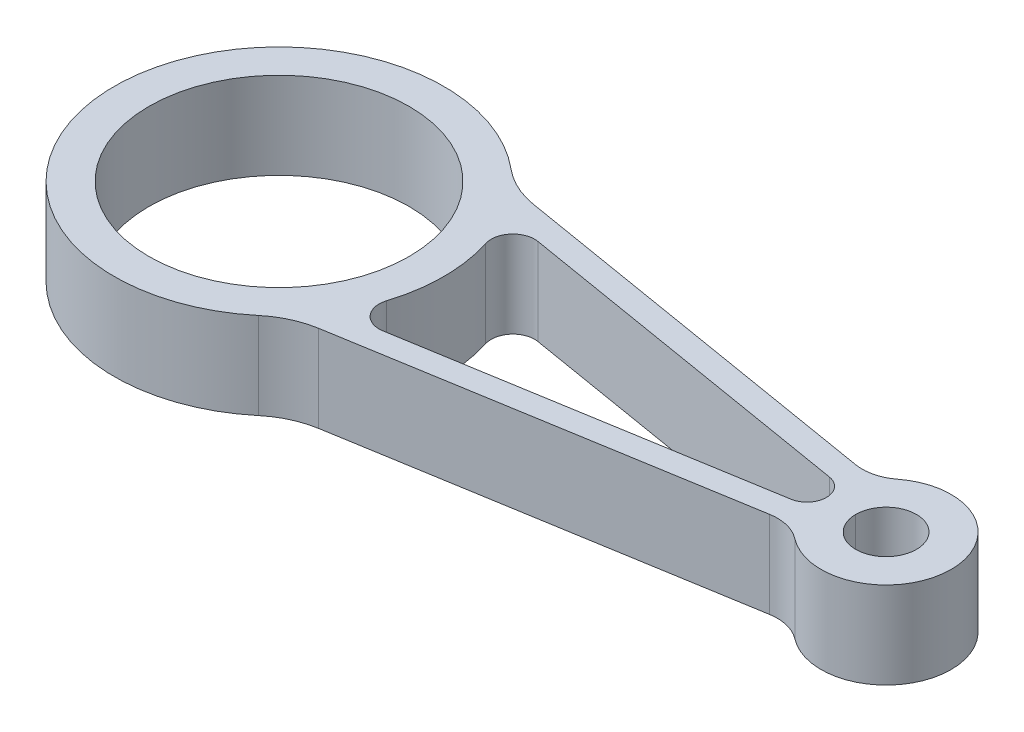
ISO-10303-21;
HEADER;
FILE_DESCRIPTION(('STEP AP214'),'2;1');
FILE_NAME('part.step','',(''),(''),'','','');
FILE_SCHEMA(('AUTOMOTIVE_DESIGN { 1 0 10303 214 1 1 1 1 }'));
ENDSEC;
DATA;
#1=APPLICATION_CONTEXT('core data for automotive mechanical design processes');
#2=APPLICATION_PROTOCOL_DEFINITION('international standard','automotive_design',2000,#1);
#3=PRODUCT_CONTEXT('',#1,'mechanical');
#4=PRODUCT('Part','Part','',(#3));
#5=PRODUCT_RELATED_PRODUCT_CATEGORY('part','',(#4));
#6=PRODUCT_DEFINITION_FORMATION('','',#4);
#7=PRODUCT_DEFINITION_CONTEXT('part definition',#1,'design');
#8=PRODUCT_DEFINITION('design','',#6,#7);
#9=PRODUCT_DEFINITION_SHAPE('','',#8);
#10=(LENGTH_UNIT() NAMED_UNIT(*) SI_UNIT(.MILLI.,.METRE.));
#11=(NAMED_UNIT(*) PLANE_ANGLE_UNIT() SI_UNIT($,.RADIAN.));
#12=(NAMED_UNIT(*) SI_UNIT($,.STERADIAN.) SOLID_ANGLE_UNIT());
#13=UNCERTAINTY_MEASURE_WITH_UNIT(LENGTH_MEASURE(1.E-05),#10,'distance_accuracy_value','');
#14=(GEOMETRIC_REPRESENTATION_CONTEXT(3) GLOBAL_UNCERTAINTY_ASSIGNED_CONTEXT((#13)) GLOBAL_UNIT_ASSIGNED_CONTEXT((#10,
#11,#12)) REPRESENTATION_CONTEXT('',''));
#15=CARTESIAN_POINT('',(0.,0.,0.));
#16=DIRECTION('',(0.,0.,1.));
#17=DIRECTION('',(1.,0.,0.));
#18=AXIS2_PLACEMENT_3D('',#15,#16,#17);
#19=CARTESIAN_POINT('',(140.,10.,0.));
#20=DIRECTION('',(0.,-1.,0.));
#21=DIRECTION('',(0.,0.,-1.));
#22=AXIS2_PLACEMENT_3D('',#19,#20,#21);
#23=CYLINDRICAL_SURFACE('',#22,7.00000000000001);
#24=CARTESIAN_POINT('',(140.,10.,0.));
#25=DIRECTION('',(0.,1.,0.));
#26=DIRECTION('',(0.,0.,1.));
#27=AXIS2_PLACEMENT_3D('',#24,#25,#26);
#28=CIRCLE('',#27,7.00000000000001);
#29=CARTESIAN_POINT('',(147.,10.,0.));
#30=VERTEX_POINT('',#29);
#31=CARTESIAN_POINT('',(133.,10.,0.));
#32=VERTEX_POINT('',#31);
#33=EDGE_CURVE('E215',#30,#32,#28,.T.);
#34=ORIENTED_EDGE('',*,*,#33,.T.);
#35=DIRECTION('',(0.,-1.,0.));
#36=VECTOR('',#35,1.);
#37=CARTESIAN_POINT('',(133.,10.,0.));
#38=LINE('',#37,#36);
#39=CARTESIAN_POINT('',(133.,-10.,0.));
#40=VERTEX_POINT('',#39);
#41=EDGE_CURVE('E11',#32,#40,#38,.T.);
#42=ORIENTED_EDGE('',*,*,#41,.T.);
#43=CARTESIAN_POINT('',(140.,-10.,0.));
#44=DIRECTION('',(0.,1.,0.));
#45=DIRECTION('',(0.,0.,1.));
#46=AXIS2_PLACEMENT_3D('',#43,#44,#45);
#47=CIRCLE('',#46,7.00000000000001);
#48=CARTESIAN_POINT('',(147.,-10.,0.));
#49=VERTEX_POINT('',#48);
#50=EDGE_CURVE('E219',#49,#40,#47,.T.);
#51=ORIENTED_EDGE('',*,*,#50,.F.);
#52=DIRECTION('',(0.,1.,0.));
#53=VECTOR('',#52,1.);
#54=CARTESIAN_POINT('',(147.,10.,0.));
#55=LINE('',#54,#53);
#56=EDGE_CURVE('E53',#49,#30,#55,.T.);
#57=ORIENTED_EDGE('',*,*,#56,.T.);
#58=EDGE_LOOP('',(#34,#42,#51,#57));
#59=FACE_BOUND('',#58,.T.);
#60=ADVANCED_FACE('F44',(#59),#23,.F.);
#61=CARTESIAN_POINT('',(0.,10.,0.));
#62=DIRECTION('',(0.,1.,0.));
#63=DIRECTION('',(0.,0.,1.));
#64=AXIS2_PLACEMENT_3D('',#61,#62,#63);
#65=PLANE('',#64);
#66=CARTESIAN_POINT('',(121.739130434783,10.,0.));
#67=DIRECTION('',(0.,1.,0.));
#68=DIRECTION('',(0.,0.,-1.));
#69=AXIS2_PLACEMENT_3D('',#66,#67,#68);
#70=CIRCLE('',#69,4.5);
#71=CARTESIAN_POINT('',(122.310930345192,10.,4.4635238167233));
#72=VERTEX_POINT('',#71);
#73=CARTESIAN_POINT('',(122.478416149068,10.,-4.43885758192951));
#74=VERTEX_POINT('',#73);
#75=EDGE_CURVE('E162',#72,#74,#70,.T.);
#76=ORIENTED_EDGE('',*,*,#75,.F.);
#77=DIRECTION('',(0.986412795984335,0.,-0.164285714285714));
#78=VECTOR('',#77,1.);
#79=CARTESIAN_POINT('',(122.310930345192,10.,4.4635238167233));
#80=LINE('',#79,#78);
#81=CARTESIAN_POINT('',(41.6520342039407,10.,17.8971536520292));
#82=VERTEX_POINT('',#81);
#83=EDGE_CURVE('E181',#82,#72,#80,.T.);
#84=ORIENTED_EDGE('',*,*,#83,.F.);
#85=CARTESIAN_POINT('',(41.0071259869049,10.,12.9389187451697));
#86=DIRECTION('',(0.,1.,0.));
#87=DIRECTION('',(0.,0.,1.));
#88=AXIS2_PLACEMENT_3D('',#85,#86,#87);
#89=CIRCLE('',#88,5.);
#90=CARTESIAN_POINT('',(36.2388555233113,10.,11.4343933096849));
#91=VERTEX_POINT('',#90);
#92=EDGE_CURVE('E184',#91,#82,#89,.T.);
#93=ORIENTED_EDGE('',*,*,#92,.F.);
#94=CARTESIAN_POINT('',(0.,10.,0.));
#95=DIRECTION('',(0.,-1.,0.));
#96=DIRECTION('',(0.,0.,-1.));
#97=AXIS2_PLACEMENT_3D('',#94,#95,#96);
#98=CIRCLE('',#97,38.);
#99=CARTESIAN_POINT('',(36.2388555233113,10.,-11.4343933096849));
#100=VERTEX_POINT('',#99);
#101=EDGE_CURVE('E200',#100,#91,#98,.T.);
#102=ORIENTED_EDGE('',*,*,#101,.F.);
#103=CARTESIAN_POINT('',(41.0071259869049,10.,-12.9389187451698));
#104=DIRECTION('',(0.,1.,0.));
#105=DIRECTION('',(0.,0.,1.));
#106=AXIS2_PLACEMENT_3D('',#103,#104,#105);
#107=CIRCLE('',#106,5.00000000000001);
#108=CARTESIAN_POINT('',(41.8285545583335,10.,-17.8709827250915));
#109=VERTEX_POINT('',#108);
#110=EDGE_CURVE('E197',#109,#100,#107,.T.);
#111=ORIENTED_EDGE('',*,*,#110,.F.);
#112=DIRECTION('',(-0.986412795984335,0.,-0.164285714285714));
#113=VECTOR('',#112,1.);
#114=CARTESIAN_POINT('',(41.8285545583335,10.,-17.8709827250915));
#115=LINE('',#114,#113);
#116=EDGE_CURVE('E195',#74,#109,#115,.T.);
#117=ORIENTED_EDGE('',*,*,#116,.F.);
#118=EDGE_LOOP('',(#76,#84,#93,#102,#111,#117));
#119=FACE_BOUND('',#118,.T.);
#120=CARTESIAN_POINT('',(0.,10.,0.));
#121=DIRECTION('',(0.,1.,0.));
#122=DIRECTION('',(0.,0.,1.));
#123=AXIS2_PLACEMENT_3D('',#120,#121,#122);
#124=CIRCLE('',#123,30.);
#125=CARTESIAN_POINT('',(0.,10.,30.));
#126=VERTEX_POINT('',#125);
#127=EDGE_CURVE('E222',#126,#126,#124,.T.);
#128=ORIENTED_EDGE('',*,*,#127,.F.);
#129=EDGE_LOOP('',(#128));
#130=FACE_BOUND('',#129,.T.);
#131=DIRECTION('',(-0.986412795984335,0.,-0.164285714285714));
#132=VECTOR('',#131,1.);
#133=CARTESIAN_POINT('',(27.9354736759495,10.,-25.7606154914888));
#134=LINE('',#133,#132);
#135=CARTESIAN_POINT('',(123.068754783715,10.,-9.91629645714703));
#136=VERTEX_POINT('',#135);
#137=CARTESIAN_POINT('',(33.9230677395359,10.,-24.7633898151861));
#138=VERTEX_POINT('',#137);
#139=EDGE_CURVE('E237',#136,#138,#134,.T.);
#140=ORIENTED_EDGE('',*,*,#139,.T.);
#141=CARTESIAN_POINT('',(37.2087820252502,10.,-44.4916457348727));
#142=DIRECTION('',(0.,1.,0.));
#143=DIRECTION('',(0.,0.,1.));
#144=AXIS2_PLACEMENT_3D('',#141,#142,#143);
#145=CIRCLE('',#144,20.);
#146=CARTESIAN_POINT('',(24.3781675337846,10.,-29.1496989297442));
#147=VERTEX_POINT('',#146);
#148=EDGE_CURVE('E285',#138,#147,#145,.F.);
#149=ORIENTED_EDGE('',*,*,#148,.T.);
#150=CARTESIAN_POINT('',(0.,10.,0.));
#151=DIRECTION('',(0.,1.,0.));
#152=DIRECTION('',(0.,0.,1.));
#153=AXIS2_PLACEMENT_3D('',#150,#151,#152);
#154=CIRCLE('',#153,38.);
#155=CARTESIAN_POINT('',(24.3781675337846,10.,29.1496989297442));
#156=VERTEX_POINT('',#155);
#157=EDGE_CURVE('E228',#147,#156,#154,.T.);
#158=ORIENTED_EDGE('',*,*,#157,.T.);
#159=CARTESIAN_POINT('',(37.2087820252501,10.,44.4916457348728));
#160=DIRECTION('',(0.,1.,0.));
#161=DIRECTION('',(0.,0.,1.));
#162=AXIS2_PLACEMENT_3D('',#159,#160,#161);
#163=CIRCLE('',#162,20.);
#164=CARTESIAN_POINT('',(33.9230677395358,10.,24.7633898151861));
#165=VERTEX_POINT('',#164);
#166=EDGE_CURVE('E281',#156,#165,#163,.F.);
#167=ORIENTED_EDGE('',*,*,#166,.T.);
#168=DIRECTION('',(0.986412795984335,0.,-0.164285714285714));
#169=VECTOR('',#168,1.);
#170=CARTESIAN_POINT('',(128.063755469258,10.,9.08438586269532));
#171=LINE('',#170,#169);
#172=CARTESIAN_POINT('',(123.068754783715,10.,9.91629645714704));
#173=VERTEX_POINT('',#172);
#174=EDGE_CURVE('E231',#165,#173,#171,.T.);
#175=ORIENTED_EDGE('',*,*,#174,.T.);
#176=CARTESIAN_POINT('',(124.711611926572,10.,19.7804244169904));
#177=DIRECTION('',(0.,1.,0.));
#178=DIRECTION('',(0.,0.,1.));
#179=AXIS2_PLACEMENT_3D('',#176,#177,#178);
#180=CIRCLE('',#179,10.);
#181=CARTESIAN_POINT('',(130.826967155943,10.,11.8682546501942));
#182=VERTEX_POINT('',#181);
#183=EDGE_CURVE('E263',#173,#182,#180,.F.);
#184=ORIENTED_EDGE('',*,*,#183,.T.);
#185=CARTESIAN_POINT('',(140.,10.,0.));
#186=DIRECTION('',(0.,1.,0.));
#187=DIRECTION('',(0.,0.,1.));
#188=AXIS2_PLACEMENT_3D('',#185,#186,#187);
#189=CIRCLE('',#188,15.);
#190=CARTESIAN_POINT('',(130.826967155943,10.,-11.8682546501942));
#191=VERTEX_POINT('',#190);
#192=EDGE_CURVE('E234',#182,#191,#189,.T.);
#193=ORIENTED_EDGE('',*,*,#192,.T.);
#194=CARTESIAN_POINT('',(124.711611926572,10.,-19.7804244169904));
#195=DIRECTION('',(0.,1.,0.));
#196=DIRECTION('',(0.,0.,1.));
#197=AXIS2_PLACEMENT_3D('',#194,#195,#196);
#198=CIRCLE('',#197,10.);
#199=EDGE_CURVE('E267',#191,#136,#198,.F.);
#200=ORIENTED_EDGE('',*,*,#199,.T.);
#201=EDGE_LOOP('',(#140,#149,#158,#167,#175,#184,#193,#200));
#202=FACE_BOUND('',#201,.T.);
#203=ORIENTED_EDGE('',*,*,#33,.F.);
#204=EDGE_CURVE('E218',#32,#30,#28,.T.);
#205=ORIENTED_EDGE('',*,*,#204,.F.);
#206=EDGE_LOOP('',(#203,#205));
#207=FACE_BOUND('',#206,.T.);
#208=ADVANCED_FACE('F293',(#119,#130,#202,#207),#65,.T.);
#209=CARTESIAN_POINT('',(0.,-10.,0.));
#210=DIRECTION('',(0.,1.,0.));
#211=DIRECTION('',(0.,0.,1.));
#212=AXIS2_PLACEMENT_3D('',#209,#210,#211);
#213=PLANE('',#212);
#214=DIRECTION('',(0.986412795984335,0.,-0.164285714285714));
#215=VECTOR('',#214,1.);
#216=CARTESIAN_POINT('',(122.310930345192,-10.,4.4635238167233));
#217=LINE('',#216,#215);
#218=CARTESIAN_POINT('',(41.6520342039407,-10.,17.8971536520292));
#219=VERTEX_POINT('',#218);
#220=CARTESIAN_POINT('',(122.310930345192,-10.,4.4635238167233));
#221=VERTEX_POINT('',#220);
#222=EDGE_CURVE('E167',#219,#221,#217,.T.);
#223=ORIENTED_EDGE('',*,*,#222,.T.);
#224=CARTESIAN_POINT('',(121.739130434783,-10.,0.));
#225=DIRECTION('',(0.,1.,0.));
#226=DIRECTION('',(0.,0.,-1.));
#227=AXIS2_PLACEMENT_3D('',#224,#225,#226);
#228=CIRCLE('',#227,4.5);
#229=CARTESIAN_POINT('',(122.478416149068,-10.,-4.43885758192951));
#230=VERTEX_POINT('',#229);
#231=EDGE_CURVE('E159',#221,#230,#228,.T.);
#232=ORIENTED_EDGE('',*,*,#231,.T.);
#233=DIRECTION('',(-0.986412795984335,0.,-0.164285714285714));
#234=VECTOR('',#233,1.);
#235=CARTESIAN_POINT('',(41.8285545583335,-10.,-17.8709827250915));
#236=LINE('',#235,#234);
#237=CARTESIAN_POINT('',(41.8285545583335,-10.,-17.8709827250915));
#238=VERTEX_POINT('',#237);
#239=EDGE_CURVE('E171',#230,#238,#236,.T.);
#240=ORIENTED_EDGE('',*,*,#239,.T.);
#241=CARTESIAN_POINT('',(41.0071259869049,-10.,-12.9389187451698));
#242=DIRECTION('',(0.,1.,0.));
#243=DIRECTION('',(0.,0.,1.));
#244=AXIS2_PLACEMENT_3D('',#241,#242,#243);
#245=CIRCLE('',#244,5.00000000000001);
#246=CARTESIAN_POINT('',(36.2388555233113,-10.,-11.4343933096849));
#247=VERTEX_POINT('',#246);
#248=EDGE_CURVE('E175',#238,#247,#245,.T.);
#249=ORIENTED_EDGE('',*,*,#248,.T.);
#250=CARTESIAN_POINT('',(0.,-10.,0.));
#251=DIRECTION('',(0.,-1.,0.));
#252=DIRECTION('',(0.,0.,-1.));
#253=AXIS2_PLACEMENT_3D('',#250,#251,#252);
#254=CIRCLE('',#253,38.);
#255=CARTESIAN_POINT('',(36.2388555233113,-10.,11.4343933096849));
#256=VERTEX_POINT('',#255);
#257=EDGE_CURVE('E188',#247,#256,#254,.T.);
#258=ORIENTED_EDGE('',*,*,#257,.T.);
#259=CARTESIAN_POINT('',(41.0071259869049,-10.,12.9389187451697));
#260=DIRECTION('',(0.,1.,0.));
#261=DIRECTION('',(0.,0.,1.));
#262=AXIS2_PLACEMENT_3D('',#259,#260,#261);
#263=CIRCLE('',#262,5.);
#264=EDGE_CURVE('E191',#256,#219,#263,.T.);
#265=ORIENTED_EDGE('',*,*,#264,.T.);
#266=EDGE_LOOP('',(#223,#232,#240,#249,#258,#265));
#267=FACE_BOUND('',#266,.T.);
#268=CARTESIAN_POINT('',(0.,-10.,0.));
#269=DIRECTION('',(0.,1.,0.));
#270=DIRECTION('',(0.,0.,1.));
#271=AXIS2_PLACEMENT_3D('',#268,#269,#270);
#272=CIRCLE('',#271,38.);
#273=CARTESIAN_POINT('',(24.3781675337846,-10.,-29.1496989297442));
#274=VERTEX_POINT('',#273);
#275=CARTESIAN_POINT('',(24.3781675337846,-10.,29.1496989297442));
#276=VERTEX_POINT('',#275);
#277=EDGE_CURVE('E225',#274,#276,#272,.T.);
#278=ORIENTED_EDGE('',*,*,#277,.F.);
#279=CARTESIAN_POINT('',(37.2087820252502,-10.,-44.4916457348727));
#280=DIRECTION('',(0.,1.,0.));
#281=DIRECTION('',(0.,0.,1.));
#282=AXIS2_PLACEMENT_3D('',#279,#280,#281);
#283=CIRCLE('',#282,20.);
#284=CARTESIAN_POINT('',(33.9230677395359,-10.,-24.7633898151861));
#285=VERTEX_POINT('',#284);
#286=EDGE_CURVE('E283',#274,#285,#283,.T.);
#287=ORIENTED_EDGE('',*,*,#286,.T.);
#288=DIRECTION('',(-0.986412795984335,0.,-0.164285714285714));
#289=VECTOR('',#288,1.);
#290=CARTESIAN_POINT('',(27.9354736759495,-10.,-25.7606154914888));
#291=LINE('',#290,#289);
#292=CARTESIAN_POINT('',(123.068754783715,-10.,-9.91629645714703));
#293=VERTEX_POINT('',#292);
#294=EDGE_CURVE('E232',#293,#285,#291,.T.);
#295=ORIENTED_EDGE('',*,*,#294,.F.);
#296=CARTESIAN_POINT('',(124.711611926572,-10.,-19.7804244169904));
#297=DIRECTION('',(0.,1.,0.));
#298=DIRECTION('',(0.,0.,1.));
#299=AXIS2_PLACEMENT_3D('',#296,#297,#298);
#300=CIRCLE('',#299,10.);
#301=CARTESIAN_POINT('',(130.826967155943,-10.,-11.8682546501942));
#302=VERTEX_POINT('',#301);
#303=EDGE_CURVE('E265',#293,#302,#300,.T.);
#304=ORIENTED_EDGE('',*,*,#303,.T.);
#305=CARTESIAN_POINT('',(140.,-10.,0.));
#306=DIRECTION('',(0.,1.,0.));
#307=DIRECTION('',(0.,0.,1.));
#308=AXIS2_PLACEMENT_3D('',#305,#306,#307);
#309=CIRCLE('',#308,15.);
#310=CARTESIAN_POINT('',(130.826967155943,-10.,11.8682546501942));
#311=VERTEX_POINT('',#310);
#312=EDGE_CURVE('E245',#311,#302,#309,.T.);
#313=ORIENTED_EDGE('',*,*,#312,.F.);
#314=CARTESIAN_POINT('',(124.711611926572,-10.,19.7804244169904));
#315=DIRECTION('',(0.,1.,0.));
#316=DIRECTION('',(0.,0.,1.));
#317=AXIS2_PLACEMENT_3D('',#314,#315,#316);
#318=CIRCLE('',#317,10.);
#319=CARTESIAN_POINT('',(123.068754783715,-10.,9.91629645714704));
#320=VERTEX_POINT('',#319);
#321=EDGE_CURVE('E260',#311,#320,#318,.T.);
#322=ORIENTED_EDGE('',*,*,#321,.T.);
#323=DIRECTION('',(0.986412795984335,0.,-0.164285714285714));
#324=VECTOR('',#323,1.);
#325=CARTESIAN_POINT('',(128.063755469258,-10.,9.08438586269532));
#326=LINE('',#325,#324);
#327=CARTESIAN_POINT('',(33.9230677395358,-10.,24.7633898151861));
#328=VERTEX_POINT('',#327);
#329=EDGE_CURVE('E243',#328,#320,#326,.T.);
#330=ORIENTED_EDGE('',*,*,#329,.F.);
#331=CARTESIAN_POINT('',(37.2087820252501,-10.,44.4916457348728));
#332=DIRECTION('',(0.,1.,0.));
#333=DIRECTION('',(0.,0.,1.));
#334=AXIS2_PLACEMENT_3D('',#331,#332,#333);
#335=CIRCLE('',#334,20.);
#336=EDGE_CURVE('E279',#328,#276,#335,.T.);
#337=ORIENTED_EDGE('',*,*,#336,.T.);
#338=EDGE_LOOP('',(#278,#287,#295,#304,#313,#322,#330,#337));
#339=FACE_BOUND('',#338,.T.);
#340=CARTESIAN_POINT('',(0.,-10.,0.));
#341=DIRECTION('',(0.,1.,0.));
#342=DIRECTION('',(0.,0.,1.));
#343=AXIS2_PLACEMENT_3D('',#340,#341,#342);
#344=CIRCLE('',#343,30.);
#345=CARTESIAN_POINT('',(0.,-10.,30.));
#346=VERTEX_POINT('',#345);
#347=EDGE_CURVE('E217',#346,#346,#344,.T.);
#348=ORIENTED_EDGE('',*,*,#347,.T.);
#349=EDGE_LOOP('',(#348));
#350=FACE_BOUND('',#349,.T.);
#351=ORIENTED_EDGE('',*,*,#50,.T.);
#352=EDGE_CURVE('E207',#40,#49,#47,.T.);
#353=ORIENTED_EDGE('',*,*,#352,.T.);
#354=EDGE_LOOP('',(#351,#353));
#355=FACE_BOUND('',#354,.T.);
#356=ADVANCED_FACE('F177',(#267,#339,#350,#355),#213,.F.);
#357=CARTESIAN_POINT('',(0.,10.,0.));
#358=DIRECTION('',(0.,-1.,0.));
#359=DIRECTION('',(0.,0.,-1.));
#360=AXIS2_PLACEMENT_3D('',#357,#358,#359);
#361=CYLINDRICAL_SURFACE('',#360,38.);
#362=ORIENTED_EDGE('',*,*,#277,.T.);
#363=DIRECTION('',(0.,-1.,0.));
#364=VECTOR('',#363,1.);
#365=CARTESIAN_POINT('',(24.3781675337846,10.,29.1496989297442));
#366=LINE('',#365,#364);
#367=EDGE_CURVE('E275',#276,#156,#366,.F.);
#368=ORIENTED_EDGE('',*,*,#367,.T.);
#369=ORIENTED_EDGE('',*,*,#157,.F.);
#370=DIRECTION('',(0.,-1.,0.));
#371=VECTOR('',#370,1.);
#372=CARTESIAN_POINT('',(24.3781675337846,10.,-29.1496989297442));
#373=LINE('',#372,#371);
#374=EDGE_CURVE('E272',#147,#274,#373,.T.);
#375=ORIENTED_EDGE('',*,*,#374,.T.);
#376=EDGE_LOOP('',(#362,#368,#369,#375));
#377=FACE_BOUND('',#376,.T.);
#378=ADVANCED_FACE('F319',(#377),#361,.T.);
#379=CARTESIAN_POINT('',(128.063755469258,10.,9.08438586269532));
#380=DIRECTION('',(-0.164285714285714,0.,-0.986412795984335));
#381=DIRECTION('',(-0.986412795984335,0.,0.164285714285714));
#382=AXIS2_PLACEMENT_3D('',#379,#380,#381);
#383=PLANE('',#382);
#384=ORIENTED_EDGE('',*,*,#174,.F.);
#385=DIRECTION('',(0.,1.,0.));
#386=VECTOR('',#385,1.);
#387=CARTESIAN_POINT('',(33.9230677395358,-10.,24.7633898151861));
#388=LINE('',#387,#386);
#389=EDGE_CURVE('E269',#165,#328,#388,.F.);
#390=ORIENTED_EDGE('',*,*,#389,.T.);
#391=ORIENTED_EDGE('',*,*,#329,.T.);
#392=DIRECTION('',(0.,1.,0.));
#393=VECTOR('',#392,1.);
#394=CARTESIAN_POINT('',(123.068754783715,10.,9.91629645714704));
#395=LINE('',#394,#393);
#396=EDGE_CURVE('E254',#320,#173,#395,.T.);
#397=ORIENTED_EDGE('',*,*,#396,.T.);
#398=EDGE_LOOP('',(#384,#390,#391,#397));
#399=FACE_BOUND('',#398,.T.);
#400=ADVANCED_FACE('F329',(#399),#383,.F.);
#401=CARTESIAN_POINT('',(140.,10.,0.));
#402=DIRECTION('',(0.,-1.,0.));
#403=DIRECTION('',(0.,0.,-1.));
#404=AXIS2_PLACEMENT_3D('',#401,#402,#403);
#405=CYLINDRICAL_SURFACE('',#404,15.);
#406=ORIENTED_EDGE('',*,*,#192,.F.);
#407=DIRECTION('',(0.,-1.,0.));
#408=VECTOR('',#407,1.);
#409=CARTESIAN_POINT('',(130.826967155943,10.,11.8682546501942));
#410=LINE('',#409,#408);
#411=EDGE_CURVE('E251',#182,#311,#410,.T.);
#412=ORIENTED_EDGE('',*,*,#411,.T.);
#413=ORIENTED_EDGE('',*,*,#312,.T.);
#414=DIRECTION('',(0.,-1.,0.));
#415=VECTOR('',#414,1.);
#416=CARTESIAN_POINT('',(130.826967155943,10.,-11.8682546501942));
#417=LINE('',#416,#415);
#418=EDGE_CURVE('E240',#302,#191,#417,.F.);
#419=ORIENTED_EDGE('',*,*,#418,.T.);
#420=EDGE_LOOP('',(#406,#412,#413,#419));
#421=FACE_BOUND('',#420,.T.);
#422=ADVANCED_FACE('F325',(#421),#405,.T.);
#423=CARTESIAN_POINT('',(27.9354736759495,10.,-25.7606154914888));
#424=DIRECTION('',(-0.164285714285714,0.,0.986412795984335));
#425=DIRECTION('',(0.986412795984335,0.,0.164285714285714));
#426=AXIS2_PLACEMENT_3D('',#423,#424,#425);
#427=PLANE('',#426);
#428=ORIENTED_EDGE('',*,*,#294,.T.);
#429=DIRECTION('',(0.,1.,0.));
#430=VECTOR('',#429,1.);
#431=CARTESIAN_POINT('',(33.9230677395359,10.,-24.7633898151861));
#432=LINE('',#431,#430);
#433=EDGE_CURVE('E277',#285,#138,#432,.T.);
#434=ORIENTED_EDGE('',*,*,#433,.T.);
#435=ORIENTED_EDGE('',*,*,#139,.F.);
#436=DIRECTION('',(0.,1.,0.));
#437=VECTOR('',#436,1.);
#438=CARTESIAN_POINT('',(123.068754783715,-10.,-9.91629645714703));
#439=LINE('',#438,#437);
#440=EDGE_CURVE('E257',#136,#293,#439,.F.);
#441=ORIENTED_EDGE('',*,*,#440,.T.);
#442=EDGE_LOOP('',(#428,#434,#435,#441));
#443=FACE_BOUND('',#442,.T.);
#444=ADVANCED_FACE('F306',(#443),#427,.F.);
#445=CARTESIAN_POINT('',(0.,10.,0.));
#446=DIRECTION('',(0.,-1.,0.));
#447=DIRECTION('',(0.,0.,-1.));
#448=AXIS2_PLACEMENT_3D('',#445,#446,#447);
#449=CYLINDRICAL_SURFACE('',#448,30.);
#450=ORIENTED_EDGE('',*,*,#127,.T.);
#451=EDGE_LOOP('',(#450));
#452=FACE_BOUND('',#451,.T.);
#453=ORIENTED_EDGE('',*,*,#347,.F.);
#454=EDGE_LOOP('',(#453));
#455=FACE_BOUND('',#454,.T.);
#456=ADVANCED_FACE('F297',(#452,#455),#449,.F.);
#457=ORIENTED_EDGE('',*,*,#41,.F.);
#458=ORIENTED_EDGE('',*,*,#204,.T.);
#459=ORIENTED_EDGE('',*,*,#56,.F.);
#460=ORIENTED_EDGE('',*,*,#352,.F.);
#461=EDGE_LOOP('',(#457,#458,#459,#460));
#462=FACE_BOUND('',#461,.T.);
#463=ADVANCED_FACE('F294',(#462),#23,.F.);
#464=CARTESIAN_POINT('',(124.711611926572,10.,19.7804244169904));
#465=DIRECTION('',(0.,-1.,0.));
#466=DIRECTION('',(0.,0.,-1.));
#467=AXIS2_PLACEMENT_3D('',#464,#465,#466);
#468=CYLINDRICAL_SURFACE('',#467,10.);
#469=ORIENTED_EDGE('',*,*,#183,.F.);
#470=ORIENTED_EDGE('',*,*,#396,.F.);
#471=ORIENTED_EDGE('',*,*,#321,.F.);
#472=ORIENTED_EDGE('',*,*,#411,.F.);
#473=EDGE_LOOP('',(#469,#470,#471,#472));
#474=FACE_BOUND('',#473,.T.);
#475=ADVANCED_FACE('F296',(#474),#468,.F.);
#476=CARTESIAN_POINT('',(124.711611926572,10.,-19.7804244169904));
#477=DIRECTION('',(0.,-1.,0.));
#478=DIRECTION('',(0.,0.,-1.));
#479=AXIS2_PLACEMENT_3D('',#476,#477,#478);
#480=CYLINDRICAL_SURFACE('',#479,10.);
#481=ORIENTED_EDGE('',*,*,#199,.F.);
#482=ORIENTED_EDGE('',*,*,#418,.F.);
#483=ORIENTED_EDGE('',*,*,#303,.F.);
#484=ORIENTED_EDGE('',*,*,#440,.F.);
#485=EDGE_LOOP('',(#481,#482,#483,#484));
#486=FACE_BOUND('',#485,.T.);
#487=ADVANCED_FACE('F303',(#486),#480,.F.);
#488=CARTESIAN_POINT('',(37.2087820252501,10.,44.4916457348728));
#489=DIRECTION('',(0.,-1.,0.));
#490=DIRECTION('',(0.,0.,-1.));
#491=AXIS2_PLACEMENT_3D('',#488,#489,#490);
#492=CYLINDRICAL_SURFACE('',#491,20.);
#493=ORIENTED_EDGE('',*,*,#166,.F.);
#494=ORIENTED_EDGE('',*,*,#367,.F.);
#495=ORIENTED_EDGE('',*,*,#336,.F.);
#496=ORIENTED_EDGE('',*,*,#389,.F.);
#497=EDGE_LOOP('',(#493,#494,#495,#496));
#498=FACE_BOUND('',#497,.T.);
#499=ADVANCED_FACE('F338',(#498),#492,.F.);
#500=CARTESIAN_POINT('',(37.2087820252502,10.,-44.4916457348727));
#501=DIRECTION('',(0.,-1.,0.));
#502=DIRECTION('',(0.,0.,-1.));
#503=AXIS2_PLACEMENT_3D('',#500,#501,#502);
#504=CYLINDRICAL_SURFACE('',#503,20.);
#505=ORIENTED_EDGE('',*,*,#148,.F.);
#506=ORIENTED_EDGE('',*,*,#433,.F.);
#507=ORIENTED_EDGE('',*,*,#286,.F.);
#508=ORIENTED_EDGE('',*,*,#374,.F.);
#509=EDGE_LOOP('',(#505,#506,#507,#508));
#510=FACE_BOUND('',#509,.T.);
#511=ADVANCED_FACE('F46',(#510),#504,.F.);
#512=CARTESIAN_POINT('',(121.739130434783,-10.,0.));
#513=DIRECTION('',(0.,1.,0.));
#514=DIRECTION('',(0.,0.,1.));
#515=AXIS2_PLACEMENT_3D('',#512,#513,#514);
#516=CYLINDRICAL_SURFACE('',#515,4.5);
#517=ORIENTED_EDGE('',*,*,#75,.T.);
#518=DIRECTION('',(0.,1.,0.));
#519=VECTOR('',#518,1.);
#520=CARTESIAN_POINT('',(122.478416149068,-10.,-4.43885758192951));
#521=LINE('',#520,#519);
#522=EDGE_CURVE('E155',#230,#74,#521,.T.);
#523=ORIENTED_EDGE('',*,*,#522,.F.);
#524=ORIENTED_EDGE('',*,*,#231,.F.);
#525=DIRECTION('',(0.,1.,0.));
#526=VECTOR('',#525,1.);
#527=CARTESIAN_POINT('',(122.310930345192,-10.,4.4635238167233));
#528=LINE('',#527,#526);
#529=EDGE_CURVE('E205',#221,#72,#528,.T.);
#530=ORIENTED_EDGE('',*,*,#529,.T.);
#531=EDGE_LOOP('',(#517,#523,#524,#530));
#532=FACE_BOUND('',#531,.T.);
#533=ADVANCED_FACE('F157',(#532),#516,.F.);
#534=CARTESIAN_POINT('',(122.310930345192,-10.,4.4635238167233));
#535=DIRECTION('',(0.164285714285714,0.,0.986412795984335));
#536=DIRECTION('',(0.986412795984335,0.,-0.164285714285714));
#537=AXIS2_PLACEMENT_3D('',#534,#535,#536);
#538=PLANE('',#537);
#539=ORIENTED_EDGE('',*,*,#83,.T.);
#540=ORIENTED_EDGE('',*,*,#529,.F.);
#541=ORIENTED_EDGE('',*,*,#222,.F.);
#542=DIRECTION('',(0.,1.,0.));
#543=VECTOR('',#542,1.);
#544=CARTESIAN_POINT('',(41.6520342039407,-10.,17.8971536520292));
#545=LINE('',#544,#543);
#546=EDGE_CURVE('E208',#219,#82,#545,.T.);
#547=ORIENTED_EDGE('',*,*,#546,.T.);
#548=EDGE_LOOP('',(#539,#540,#541,#547));
#549=FACE_BOUND('',#548,.T.);
#550=ADVANCED_FACE('F374',(#549),#538,.F.);
#551=CARTESIAN_POINT('',(41.0071259869049,-10.,12.9389187451697));
#552=DIRECTION('',(0.,1.,0.));
#553=DIRECTION('',(0.,0.,1.));
#554=AXIS2_PLACEMENT_3D('',#551,#552,#553);
#555=CYLINDRICAL_SURFACE('',#554,5.);
#556=ORIENTED_EDGE('',*,*,#92,.T.);
#557=ORIENTED_EDGE('',*,*,#546,.F.);
#558=ORIENTED_EDGE('',*,*,#264,.F.);
#559=DIRECTION('',(0.,1.,0.));
#560=VECTOR('',#559,1.);
#561=CARTESIAN_POINT('',(36.2388555233113,-10.,11.4343933096849));
#562=LINE('',#561,#560);
#563=EDGE_CURVE('E210',#256,#91,#562,.T.);
#564=ORIENTED_EDGE('',*,*,#563,.T.);
#565=EDGE_LOOP('',(#556,#557,#558,#564));
#566=FACE_BOUND('',#565,.T.);
#567=ADVANCED_FACE('F378',(#566),#555,.F.);
#568=CARTESIAN_POINT('',(0.,-10.,0.));
#569=DIRECTION('',(0.,1.,0.));
#570=DIRECTION('',(0.,0.,1.));
#571=AXIS2_PLACEMENT_3D('',#568,#569,#570);
#572=CYLINDRICAL_SURFACE('',#571,38.);
#573=ORIENTED_EDGE('',*,*,#101,.T.);
#574=ORIENTED_EDGE('',*,*,#563,.F.);
#575=ORIENTED_EDGE('',*,*,#257,.F.);
#576=DIRECTION('',(0.,1.,0.));
#577=VECTOR('',#576,1.);
#578=CARTESIAN_POINT('',(36.2388555233113,-10.,-11.4343933096849));
#579=LINE('',#578,#577);
#580=EDGE_CURVE('E212',#247,#100,#579,.T.);
#581=ORIENTED_EDGE('',*,*,#580,.T.);
#582=EDGE_LOOP('',(#573,#574,#575,#581));
#583=FACE_BOUND('',#582,.T.);
#584=ADVANCED_FACE('F387',(#583),#572,.T.);
#585=CARTESIAN_POINT('',(41.0071259869049,-10.,-12.9389187451698));
#586=DIRECTION('',(0.,1.,0.));
#587=DIRECTION('',(0.,0.,1.));
#588=AXIS2_PLACEMENT_3D('',#585,#586,#587);
#589=CYLINDRICAL_SURFACE('',#588,5.00000000000001);
#590=ORIENTED_EDGE('',*,*,#110,.T.);
#591=ORIENTED_EDGE('',*,*,#580,.F.);
#592=ORIENTED_EDGE('',*,*,#248,.F.);
#593=DIRECTION('',(0.,1.,0.));
#594=VECTOR('',#593,1.);
#595=CARTESIAN_POINT('',(41.8285545583335,-10.,-17.8709827250915));
#596=LINE('',#595,#594);
#597=EDGE_CURVE('E166',#238,#109,#596,.T.);
#598=ORIENTED_EDGE('',*,*,#597,.T.);
#599=EDGE_LOOP('',(#590,#591,#592,#598));
#600=FACE_BOUND('',#599,.T.);
#601=ADVANCED_FACE('F384',(#600),#589,.F.);
#602=CARTESIAN_POINT('',(41.8285545583335,-10.,-17.8709827250915));
#603=DIRECTION('',(0.164285714285714,0.,-0.986412795984335));
#604=DIRECTION('',(-0.986412795984335,0.,-0.164285714285714));
#605=AXIS2_PLACEMENT_3D('',#602,#603,#604);
#606=PLANE('',#605);
#607=ORIENTED_EDGE('',*,*,#116,.T.);
#608=ORIENTED_EDGE('',*,*,#597,.F.);
#609=ORIENTED_EDGE('',*,*,#239,.F.);
#610=ORIENTED_EDGE('',*,*,#522,.T.);
#611=EDGE_LOOP('',(#607,#608,#609,#610));
#612=FACE_BOUND('',#611,.T.);
#613=ADVANCED_FACE('F172',(#612),#606,.F.);
#614=CLOSED_SHELL('',(#60,#208,#356,#378,#400,#422,#444,#456,#463,#475,#487,#499,#511,#533,#550,
#567,#584,#601,#613));
#615=MANIFOLD_SOLID_BREP('B2',#614);
#616=ADVANCED_BREP_SHAPE_REPRESENTATION('',(#18,#615),#14);
#617=SHAPE_DEFINITION_REPRESENTATION(#9,#616);
ENDSEC;
END-ISO-10303-21;
